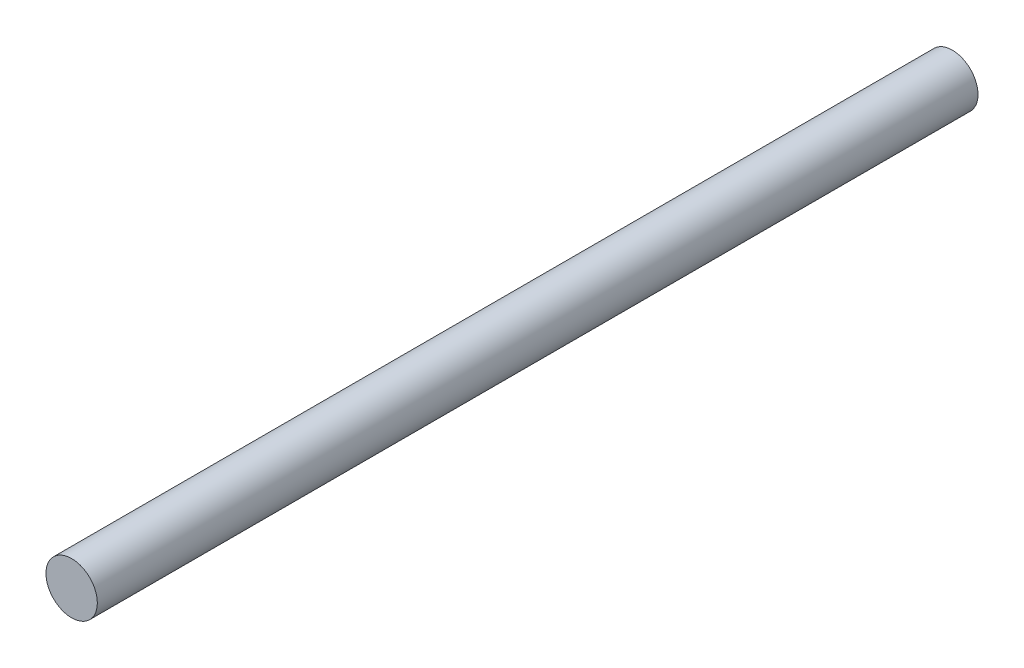
ISO-10303-21;
HEADER;
FILE_DESCRIPTION(('STEP AP214'),'2;1');
FILE_NAME('part.step','',(''),(''),'','','');
FILE_SCHEMA(('AUTOMOTIVE_DESIGN { 1 0 10303 214 1 1 1 1 }'));
ENDSEC;
DATA;
#1=APPLICATION_CONTEXT('core data for automotive mechanical design processes');
#2=APPLICATION_PROTOCOL_DEFINITION('international standard','automotive_design',2000,#1);
#3=PRODUCT_CONTEXT('',#1,'mechanical');
#4=PRODUCT('Part','Part','',(#3));
#5=PRODUCT_RELATED_PRODUCT_CATEGORY('part','',(#4));
#6=PRODUCT_DEFINITION_FORMATION('','',#4);
#7=PRODUCT_DEFINITION_CONTEXT('part definition',#1,'design');
#8=PRODUCT_DEFINITION('design','',#6,#7);
#9=PRODUCT_DEFINITION_SHAPE('','',#8);
#10=(LENGTH_UNIT() NAMED_UNIT(*) SI_UNIT(.MILLI.,.METRE.));
#11=(NAMED_UNIT(*) PLANE_ANGLE_UNIT() SI_UNIT($,.RADIAN.));
#12=(NAMED_UNIT(*) SI_UNIT($,.STERADIAN.) SOLID_ANGLE_UNIT());
#13=UNCERTAINTY_MEASURE_WITH_UNIT(LENGTH_MEASURE(1.E-05),#10,'distance_accuracy_value','');
#14=(GEOMETRIC_REPRESENTATION_CONTEXT(3) GLOBAL_UNCERTAINTY_ASSIGNED_CONTEXT((#13)) GLOBAL_UNIT_ASSIGNED_CONTEXT((#10,
#11,#12)) REPRESENTATION_CONTEXT('',''));
#15=CARTESIAN_POINT('',(0.,0.,0.));
#16=DIRECTION('',(0.,0.,1.));
#17=DIRECTION('',(1.,0.,0.));
#18=AXIS2_PLACEMENT_3D('',#15,#16,#17);
#19=CARTESIAN_POINT('',(0.,0.,240.));
#20=DIRECTION('',(0.,0.,-1.));
#21=DIRECTION('',(-1.,0.,0.));
#22=AXIS2_PLACEMENT_3D('',#19,#20,#21);
#23=CYLINDRICAL_SURFACE('',#22,7.);
#24=CARTESIAN_POINT('',(0.,0.,240.));
#25=DIRECTION('',(0.,0.,1.));
#26=DIRECTION('',(1.,0.,0.));
#27=AXIS2_PLACEMENT_3D('',#24,#25,#26);
#28=CIRCLE('',#27,7.);
#29=CARTESIAN_POINT('',(7.,0.,240.));
#30=VERTEX_POINT('',#29);
#31=EDGE_CURVE('E10',#30,#30,#28,.T.);
#32=ORIENTED_EDGE('',*,*,#31,.F.);
#33=EDGE_LOOP('',(#32));
#34=FACE_BOUND('',#33,.T.);
#35=CARTESIAN_POINT('',(0.,0.,0.));
#36=DIRECTION('',(0.,0.,1.));
#37=DIRECTION('',(1.,0.,0.));
#38=AXIS2_PLACEMENT_3D('',#35,#36,#37);
#39=CIRCLE('',#38,7.);
#40=CARTESIAN_POINT('',(7.,0.,0.));
#41=VERTEX_POINT('',#40);
#42=EDGE_CURVE('E33',#41,#41,#39,.T.);
#43=ORIENTED_EDGE('',*,*,#42,.T.);
#44=EDGE_LOOP('',(#43));
#45=FACE_BOUND('',#44,.T.);
#46=ADVANCED_FACE('F30',(#34,#45),#23,.T.);
#47=CARTESIAN_POINT('',(0.,0.,240.));
#48=DIRECTION('',(0.,0.,1.));
#49=DIRECTION('',(1.,0.,0.));
#50=AXIS2_PLACEMENT_3D('',#47,#48,#49);
#51=PLANE('',#50);
#52=ORIENTED_EDGE('',*,*,#31,.T.);
#53=EDGE_LOOP('',(#52));
#54=FACE_BOUND('',#53,.T.);
#55=ADVANCED_FACE('F45',(#54),#51,.T.);
#56=CARTESIAN_POINT('',(0.,0.,0.));
#57=DIRECTION('',(0.,0.,1.));
#58=DIRECTION('',(1.,0.,0.));
#59=AXIS2_PLACEMENT_3D('',#56,#57,#58);
#60=PLANE('',#59);
#61=ORIENTED_EDGE('',*,*,#42,.F.);
#62=EDGE_LOOP('',(#61));
#63=FACE_BOUND('',#62,.T.);
#64=ADVANCED_FACE('F43',(#63),#60,.F.);
#65=CLOSED_SHELL('',(#46,#55,#64));
#66=MANIFOLD_SOLID_BREP('B2',#65);
#67=ADVANCED_BREP_SHAPE_REPRESENTATION('',(#18,#66),#14);
#68=SHAPE_DEFINITION_REPRESENTATION(#9,#67);
ENDSEC;
END-ISO-10303-21;
